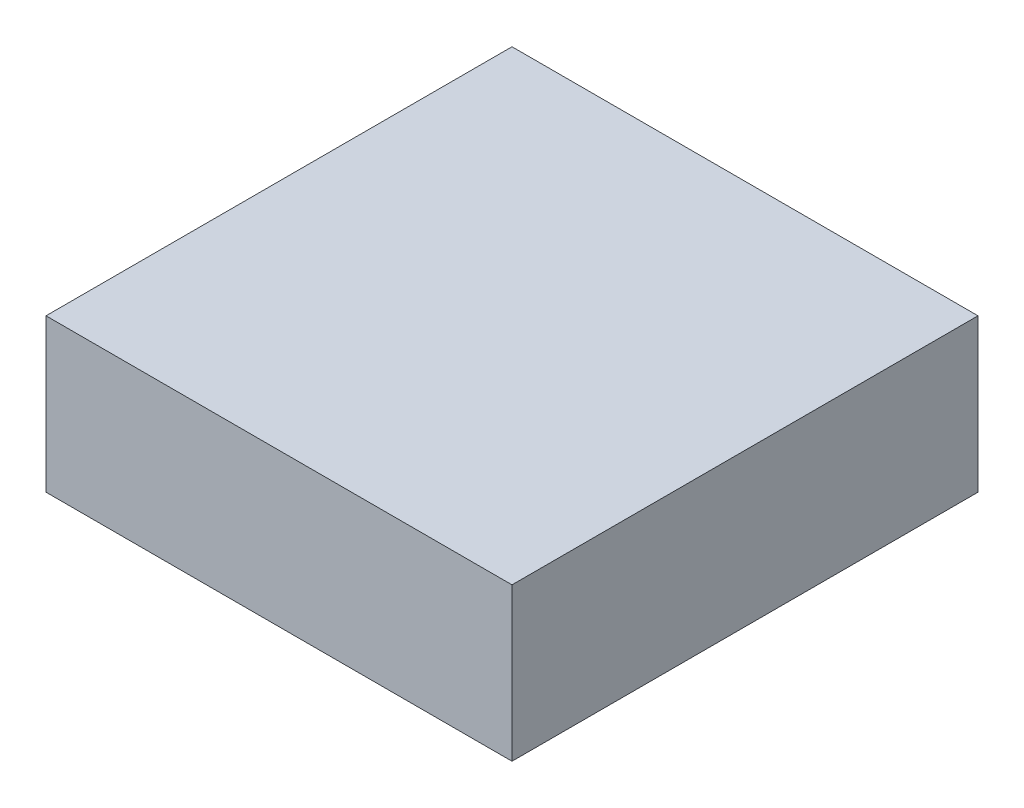
ISO-10303-21;
HEADER;
FILE_DESCRIPTION(('STEP AP214'),'2;1');
FILE_NAME('part.step','',(''),(''),'','','');
FILE_SCHEMA(('AUTOMOTIVE_DESIGN { 1 0 10303 214 1 1 1 1 }'));
ENDSEC;
DATA;
#1=APPLICATION_CONTEXT('core data for automotive mechanical design processes');
#2=APPLICATION_PROTOCOL_DEFINITION('international standard','automotive_design',2000,#1);
#3=PRODUCT_CONTEXT('',#1,'mechanical');
#4=PRODUCT('Part','Part','',(#3));
#5=PRODUCT_RELATED_PRODUCT_CATEGORY('part','',(#4));
#6=PRODUCT_DEFINITION_FORMATION('','',#4);
#7=PRODUCT_DEFINITION_CONTEXT('part definition',#1,'design');
#8=PRODUCT_DEFINITION('design','',#6,#7);
#9=PRODUCT_DEFINITION_SHAPE('','',#8);
#10=(LENGTH_UNIT() NAMED_UNIT(*) SI_UNIT(.MILLI.,.METRE.));
#11=(NAMED_UNIT(*) PLANE_ANGLE_UNIT() SI_UNIT($,.RADIAN.));
#12=(NAMED_UNIT(*) SI_UNIT($,.STERADIAN.) SOLID_ANGLE_UNIT());
#13=UNCERTAINTY_MEASURE_WITH_UNIT(LENGTH_MEASURE(1.E-05),#10,'distance_accuracy_value','');
#14=(GEOMETRIC_REPRESENTATION_CONTEXT(3) GLOBAL_UNCERTAINTY_ASSIGNED_CONTEXT((#13)) GLOBAL_UNIT_ASSIGNED_CONTEXT((#10,
#11,#12)) REPRESENTATION_CONTEXT('',''));
#15=CARTESIAN_POINT('',(0.,0.,0.));
#16=DIRECTION('',(0.,0.,1.));
#17=DIRECTION('',(1.,0.,0.));
#18=AXIS2_PLACEMENT_3D('',#15,#16,#17);
#19=CARTESIAN_POINT('',(-3.05,2.,3.05));
#20=DIRECTION('',(1.,0.,0.));
#21=DIRECTION('',(0.,0.,-1.));
#22=AXIS2_PLACEMENT_3D('',#19,#20,#21);
#23=PLANE('',#22);
#24=DIRECTION('',(0.,0.,1.));
#25=VECTOR('',#24,1.);
#26=CARTESIAN_POINT('',(-3.05,0.,3.05));
#27=LINE('',#26,#25);
#28=CARTESIAN_POINT('',(-3.05,0.,-3.05));
#29=VERTEX_POINT('',#28);
#30=CARTESIAN_POINT('',(-3.05,0.,3.05));
#31=VERTEX_POINT('',#30);
#32=EDGE_CURVE('E96',#29,#31,#27,.T.);
#33=ORIENTED_EDGE('',*,*,#32,.T.);
#34=DIRECTION('',(0.,-1.,0.));
#35=VECTOR('',#34,1.);
#36=CARTESIAN_POINT('',(-3.05,2.,3.05));
#37=LINE('',#36,#35);
#38=CARTESIAN_POINT('',(-3.05,2.,3.05));
#39=VERTEX_POINT('',#38);
#40=EDGE_CURVE('E11',#39,#31,#37,.T.);
#41=ORIENTED_EDGE('',*,*,#40,.F.);
#42=DIRECTION('',(0.,0.,1.));
#43=VECTOR('',#42,1.);
#44=CARTESIAN_POINT('',(-3.05,2.,3.05));
#45=LINE('',#44,#43);
#46=CARTESIAN_POINT('',(-3.05,2.,-3.05));
#47=VERTEX_POINT('',#46);
#48=EDGE_CURVE('E84',#47,#39,#45,.T.);
#49=ORIENTED_EDGE('',*,*,#48,.F.);
#50=DIRECTION('',(0.,-1.,0.));
#51=VECTOR('',#50,1.);
#52=CARTESIAN_POINT('',(-3.05,2.,-3.05));
#53=LINE('',#52,#51);
#54=EDGE_CURVE('E92',#47,#29,#53,.T.);
#55=ORIENTED_EDGE('',*,*,#54,.T.);
#56=EDGE_LOOP('',(#33,#41,#49,#55));
#57=FACE_BOUND('',#56,.T.);
#58=ADVANCED_FACE('F33',(#57),#23,.F.);
#59=CARTESIAN_POINT('',(3.05,2.,3.05));
#60=DIRECTION('',(0.,0.,-1.));
#61=DIRECTION('',(-1.,0.,0.));
#62=AXIS2_PLACEMENT_3D('',#59,#60,#61);
#63=PLANE('',#62);
#64=DIRECTION('',(1.,0.,0.));
#65=VECTOR('',#64,1.);
#66=CARTESIAN_POINT('',(3.05,0.,3.05));
#67=LINE('',#66,#65);
#68=CARTESIAN_POINT('',(3.05,0.,3.05));
#69=VERTEX_POINT('',#68);
#70=EDGE_CURVE('E88',#31,#69,#67,.T.);
#71=ORIENTED_EDGE('',*,*,#70,.T.);
#72=DIRECTION('',(0.,-1.,0.));
#73=VECTOR('',#72,1.);
#74=CARTESIAN_POINT('',(3.05,2.,3.05));
#75=LINE('',#74,#73);
#76=CARTESIAN_POINT('',(3.05,2.,3.05));
#77=VERTEX_POINT('',#76);
#78=EDGE_CURVE('E41',#77,#69,#75,.T.);
#79=ORIENTED_EDGE('',*,*,#78,.F.);
#80=DIRECTION('',(1.,0.,0.));
#81=VECTOR('',#80,1.);
#82=CARTESIAN_POINT('',(3.05,2.,3.05));
#83=LINE('',#82,#81);
#84=EDGE_CURVE('E79',#39,#77,#83,.T.);
#85=ORIENTED_EDGE('',*,*,#84,.F.);
#86=ORIENTED_EDGE('',*,*,#40,.T.);
#87=EDGE_LOOP('',(#71,#79,#85,#86));
#88=FACE_BOUND('',#87,.T.);
#89=ADVANCED_FACE('F87',(#88),#63,.F.);
#90=CARTESIAN_POINT('',(3.05,2.,3.05));
#91=DIRECTION('',(-1.,0.,0.));
#92=DIRECTION('',(0.,0.,1.));
#93=AXIS2_PLACEMENT_3D('',#90,#91,#92);
#94=PLANE('',#93);
#95=DIRECTION('',(0.,0.,-1.));
#96=VECTOR('',#95,1.);
#97=CARTESIAN_POINT('',(3.05,0.,3.05));
#98=LINE('',#97,#96);
#99=CARTESIAN_POINT('',(3.05,0.,-3.05));
#100=VERTEX_POINT('',#99);
#101=EDGE_CURVE('E66',#69,#100,#98,.T.);
#102=ORIENTED_EDGE('',*,*,#101,.T.);
#103=DIRECTION('',(0.,-1.,0.));
#104=VECTOR('',#103,1.);
#105=CARTESIAN_POINT('',(3.05,2.,-3.05));
#106=LINE('',#105,#104);
#107=CARTESIAN_POINT('',(3.05,2.,-3.05));
#108=VERTEX_POINT('',#107);
#109=EDGE_CURVE('E89',#108,#100,#106,.T.);
#110=ORIENTED_EDGE('',*,*,#109,.F.);
#111=DIRECTION('',(0.,0.,-1.));
#112=VECTOR('',#111,1.);
#113=CARTESIAN_POINT('',(3.05,2.,3.05));
#114=LINE('',#113,#112);
#115=EDGE_CURVE('E82',#77,#108,#114,.T.);
#116=ORIENTED_EDGE('',*,*,#115,.F.);
#117=ORIENTED_EDGE('',*,*,#78,.T.);
#118=EDGE_LOOP('',(#102,#110,#116,#117));
#119=FACE_BOUND('',#118,.T.);
#120=ADVANCED_FACE('F90',(#119),#94,.F.);
#121=CARTESIAN_POINT('',(3.05,2.,-3.05));
#122=DIRECTION('',(0.,0.,1.));
#123=DIRECTION('',(1.,0.,0.));
#124=AXIS2_PLACEMENT_3D('',#121,#122,#123);
#125=PLANE('',#124);
#126=DIRECTION('',(-1.,0.,0.));
#127=VECTOR('',#126,1.);
#128=CARTESIAN_POINT('',(3.05,0.,-3.05));
#129=LINE('',#128,#127);
#130=EDGE_CURVE('E72',#100,#29,#129,.T.);
#131=ORIENTED_EDGE('',*,*,#130,.T.);
#132=ORIENTED_EDGE('',*,*,#54,.F.);
#133=DIRECTION('',(-1.,0.,0.));
#134=VECTOR('',#133,1.);
#135=CARTESIAN_POINT('',(3.05,2.,-3.05));
#136=LINE('',#135,#134);
#137=EDGE_CURVE('E49',#108,#47,#136,.T.);
#138=ORIENTED_EDGE('',*,*,#137,.F.);
#139=ORIENTED_EDGE('',*,*,#109,.T.);
#140=EDGE_LOOP('',(#131,#132,#138,#139));
#141=FACE_BOUND('',#140,.T.);
#142=ADVANCED_FACE('F103',(#141),#125,.F.);
#143=CARTESIAN_POINT('',(0.,2.,0.));
#144=DIRECTION('',(0.,1.,0.));
#145=DIRECTION('',(0.,0.,1.));
#146=AXIS2_PLACEMENT_3D('',#143,#144,#145);
#147=PLANE('',#146);
#148=ORIENTED_EDGE('',*,*,#48,.T.);
#149=ORIENTED_EDGE('',*,*,#84,.T.);
#150=ORIENTED_EDGE('',*,*,#115,.T.);
#151=ORIENTED_EDGE('',*,*,#137,.T.);
#152=EDGE_LOOP('',(#148,#149,#150,#151));
#153=FACE_BOUND('',#152,.T.);
#154=ADVANCED_FACE('F80',(#153),#147,.T.);
#155=CARTESIAN_POINT('',(0.,0.,0.));
#156=DIRECTION('',(0.,1.,0.));
#157=DIRECTION('',(0.,0.,1.));
#158=AXIS2_PLACEMENT_3D('',#155,#156,#157);
#159=PLANE('',#158);
#160=ORIENTED_EDGE('',*,*,#32,.F.);
#161=ORIENTED_EDGE('',*,*,#130,.F.);
#162=ORIENTED_EDGE('',*,*,#101,.F.);
#163=ORIENTED_EDGE('',*,*,#70,.F.);
#164=EDGE_LOOP('',(#160,#161,#162,#163));
#165=FACE_BOUND('',#164,.T.);
#166=ADVANCED_FACE('F106',(#165),#159,.F.);
#167=CLOSED_SHELL('',(#58,#89,#120,#142,#154,#166));
#168=MANIFOLD_SOLID_BREP('B2',#167);
#169=ADVANCED_BREP_SHAPE_REPRESENTATION('',(#18,#168),#14);
#170=SHAPE_DEFINITION_REPRESENTATION(#9,#169);
ENDSEC;
END-ISO-10303-21;
